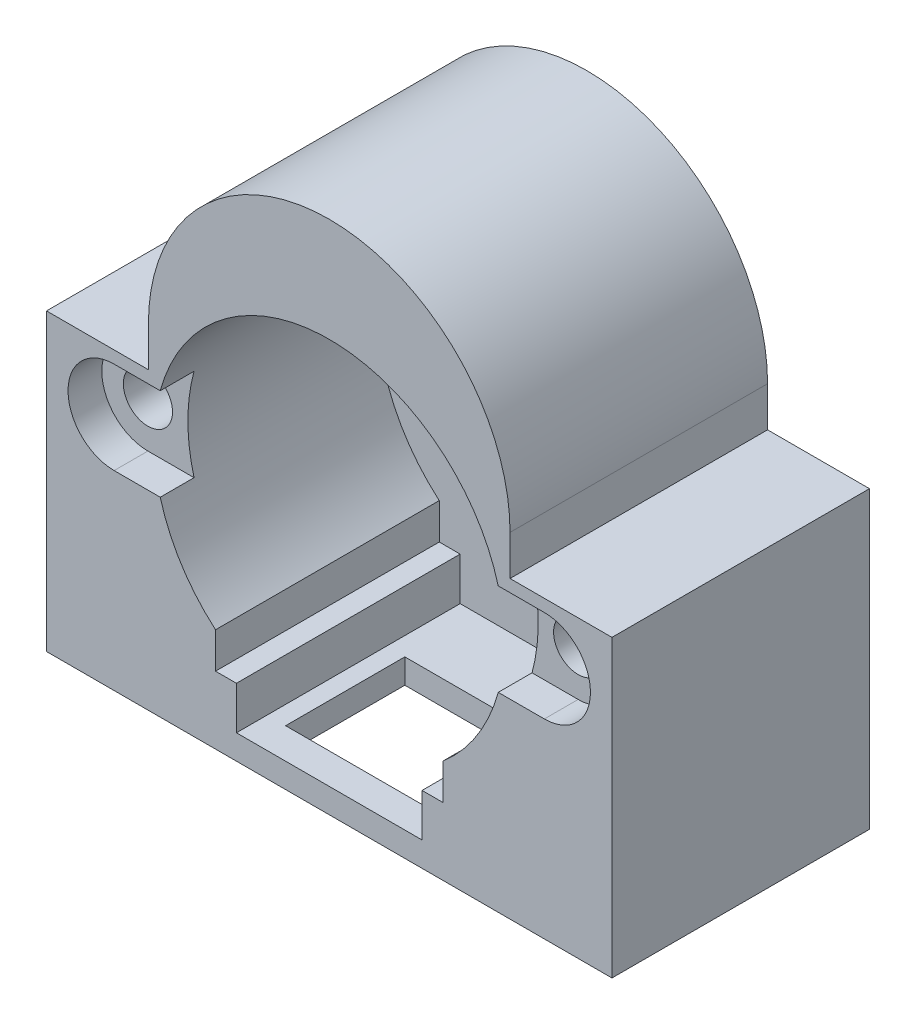
ISO-10303-21;
HEADER;
FILE_DESCRIPTION(('STEP AP214'),'2;1');
FILE_NAME('part.step','',(''),(''),'','','');
FILE_SCHEMA(('AUTOMOTIVE_DESIGN { 1 0 10303 214 1 1 1 1 }'));
ENDSEC;
DATA;
#1=APPLICATION_CONTEXT('core data for automotive mechanical design processes');
#2=APPLICATION_PROTOCOL_DEFINITION('international standard','automotive_design',2000,#1);
#3=PRODUCT_CONTEXT('',#1,'mechanical');
#4=PRODUCT('Part','Part','',(#3));
#5=PRODUCT_RELATED_PRODUCT_CATEGORY('part','',(#4));
#6=PRODUCT_DEFINITION_FORMATION('','',#4);
#7=PRODUCT_DEFINITION_CONTEXT('part definition',#1,'design');
#8=PRODUCT_DEFINITION('design','',#6,#7);
#9=PRODUCT_DEFINITION_SHAPE('','',#8);
#10=(LENGTH_UNIT() NAMED_UNIT(*) SI_UNIT(.MILLI.,.METRE.));
#11=(NAMED_UNIT(*) PLANE_ANGLE_UNIT() SI_UNIT($,.RADIAN.));
#12=(NAMED_UNIT(*) SI_UNIT($,.STERADIAN.) SOLID_ANGLE_UNIT());
#13=UNCERTAINTY_MEASURE_WITH_UNIT(LENGTH_MEASURE(1.E-05),#10,'distance_accuracy_value','');
#14=(GEOMETRIC_REPRESENTATION_CONTEXT(3) GLOBAL_UNCERTAINTY_ASSIGNED_CONTEXT((#13)) GLOBAL_UNIT_ASSIGNED_CONTEXT((#10,
#11,#12)) REPRESENTATION_CONTEXT('',''));
#15=CARTESIAN_POINT('',(0.,0.,0.));
#16=DIRECTION('',(0.,0.,1.));
#17=DIRECTION('',(1.,0.,0.));
#18=AXIS2_PLACEMENT_3D('',#15,#16,#17);
#19=CARTESIAN_POINT('',(-23.,-19.25,20.95));
#20=DIRECTION('',(0.,1.,0.));
#21=DIRECTION('',(0.,0.,1.));
#22=AXIS2_PLACEMENT_3D('',#19,#20,#21);
#23=PLANE('',#22);
#24=DIRECTION('',(0.,0.,-1.));
#25=VECTOR('',#24,1.);
#26=CARTESIAN_POINT('',(-23.,-19.25,20.95));
#27=LINE('',#26,#25);
#28=CARTESIAN_POINT('',(-23.,-19.25,20.95));
#29=VERTEX_POINT('',#28);
#30=CARTESIAN_POINT('',(-23.,-19.25,0.));
#31=VERTEX_POINT('',#30);
#32=EDGE_CURVE('E427',#29,#31,#27,.T.);
#33=ORIENTED_EDGE('',*,*,#32,.T.);
#34=DIRECTION('',(1.,0.,0.));
#35=VECTOR('',#34,1.);
#36=CARTESIAN_POINT('',(-23.,-19.25,0.));
#37=LINE('',#36,#35);
#38=CARTESIAN_POINT('',(23.,-19.25,0.));
#39=VERTEX_POINT('',#38);
#40=EDGE_CURVE('E419',#31,#39,#37,.T.);
#41=ORIENTED_EDGE('',*,*,#40,.T.);
#42=DIRECTION('',(0.,0.,-1.));
#43=VECTOR('',#42,1.);
#44=CARTESIAN_POINT('',(23.,-19.25,20.95));
#45=LINE('',#44,#43);
#46=CARTESIAN_POINT('',(23.,-19.25,20.95));
#47=VERTEX_POINT('',#46);
#48=EDGE_CURVE('E425',#47,#39,#45,.T.);
#49=ORIENTED_EDGE('',*,*,#48,.F.);
#50=DIRECTION('',(1.,0.,0.));
#51=VECTOR('',#50,1.);
#52=CARTESIAN_POINT('',(-23.,-19.25,20.95));
#53=LINE('',#52,#51);
#54=EDGE_CURVE('E408',#29,#47,#53,.T.);
#55=ORIENTED_EDGE('',*,*,#54,.F.);
#56=EDGE_LOOP('',(#33,#41,#49,#55));
#57=FACE_BOUND('',#56,.T.);
#58=DIRECTION('',(0.,0.,-1.));
#59=VECTOR('',#58,1.);
#60=CARTESIAN_POINT('',(6.05,-19.25,18.45));
#61=LINE('',#60,#59);
#62=CARTESIAN_POINT('',(6.05,-19.25,18.45));
#63=VERTEX_POINT('',#62);
#64=CARTESIAN_POINT('',(6.05,-19.25,8.75));
#65=VERTEX_POINT('',#64);
#66=EDGE_CURVE('E56',#63,#65,#61,.T.);
#67=ORIENTED_EDGE('',*,*,#66,.T.);
#68=DIRECTION('',(-1.,0.,0.));
#69=VECTOR('',#68,1.);
#70=CARTESIAN_POINT('',(6.05,-19.25,8.75));
#71=LINE('',#70,#69);
#72=CARTESIAN_POINT('',(-6.05,-19.25,8.75));
#73=VERTEX_POINT('',#72);
#74=EDGE_CURVE('E246',#65,#73,#71,.T.);
#75=ORIENTED_EDGE('',*,*,#74,.T.);
#76=DIRECTION('',(0.,0.,1.));
#77=VECTOR('',#76,1.);
#78=CARTESIAN_POINT('',(-6.05,-19.25,18.45));
#79=LINE('',#78,#77);
#80=CARTESIAN_POINT('',(-6.05,-19.25,18.45));
#81=VERTEX_POINT('',#80);
#82=EDGE_CURVE('E253',#73,#81,#79,.T.);
#83=ORIENTED_EDGE('',*,*,#82,.T.);
#84=DIRECTION('',(1.,0.,0.));
#85=VECTOR('',#84,1.);
#86=CARTESIAN_POINT('',(6.05,-19.25,18.45));
#87=LINE('',#86,#85);
#88=EDGE_CURVE('E233',#81,#63,#87,.T.);
#89=ORIENTED_EDGE('',*,*,#88,.T.);
#90=EDGE_LOOP('',(#67,#75,#83,#89));
#91=FACE_BOUND('',#90,.T.);
#92=ADVANCED_FACE('F39',(#57,#91),#23,.F.);
#93=CARTESIAN_POINT('',(-7.55,-17.25,20.95));
#94=DIRECTION('',(0.,1.,0.));
#95=DIRECTION('',(0.,0.,1.));
#96=AXIS2_PLACEMENT_3D('',#93,#94,#95);
#97=PLANE('',#96);
#98=DIRECTION('',(1.,0.,0.));
#99=VECTOR('',#98,1.);
#100=CARTESIAN_POINT('',(-7.55,-17.25,2.75));
#101=LINE('',#100,#99);
#102=CARTESIAN_POINT('',(-7.55,-17.25,2.75));
#103=VERTEX_POINT('',#102);
#104=CARTESIAN_POINT('',(7.55,-17.25,2.75));
#105=VERTEX_POINT('',#104);
#106=EDGE_CURVE('E354',#103,#105,#101,.T.);
#107=ORIENTED_EDGE('',*,*,#106,.F.);
#108=DIRECTION('',(0.,0.,-1.));
#109=VECTOR('',#108,1.);
#110=CARTESIAN_POINT('',(-7.55,-17.25,20.95));
#111=LINE('',#110,#109);
#112=CARTESIAN_POINT('',(-7.55,-17.25,20.95));
#113=VERTEX_POINT('',#112);
#114=EDGE_CURVE('E399',#113,#103,#111,.T.);
#115=ORIENTED_EDGE('',*,*,#114,.F.);
#116=DIRECTION('',(1.,0.,0.));
#117=VECTOR('',#116,1.);
#118=CARTESIAN_POINT('',(-7.55,-17.25,20.95));
#119=LINE('',#118,#117);
#120=CARTESIAN_POINT('',(7.55,-17.25,20.95));
#121=VERTEX_POINT('',#120);
#122=EDGE_CURVE('E367',#113,#121,#119,.T.);
#123=ORIENTED_EDGE('',*,*,#122,.T.);
#124=DIRECTION('',(0.,0.,-1.));
#125=VECTOR('',#124,1.);
#126=CARTESIAN_POINT('',(7.55,-17.25,20.95));
#127=LINE('',#126,#125);
#128=EDGE_CURVE('E396',#121,#105,#127,.T.);
#129=ORIENTED_EDGE('',*,*,#128,.T.);
#130=EDGE_LOOP('',(#107,#115,#123,#129));
#131=FACE_BOUND('',#130,.T.);
#132=DIRECTION('',(-1.,0.,0.));
#133=VECTOR('',#132,1.);
#134=CARTESIAN_POINT('',(6.05,-17.25,8.75));
#135=LINE('',#134,#133);
#136=CARTESIAN_POINT('',(6.05,-17.25,8.75));
#137=VERTEX_POINT('',#136);
#138=CARTESIAN_POINT('',(-6.05,-17.25,8.75));
#139=VERTEX_POINT('',#138);
#140=EDGE_CURVE('E244',#137,#139,#135,.T.);
#141=ORIENTED_EDGE('',*,*,#140,.F.);
#142=DIRECTION('',(0.,0.,-1.));
#143=VECTOR('',#142,1.);
#144=CARTESIAN_POINT('',(6.05,-17.25,18.45));
#145=LINE('',#144,#143);
#146=CARTESIAN_POINT('',(6.05,-17.25,18.45));
#147=VERTEX_POINT('',#146);
#148=EDGE_CURVE('E227',#147,#137,#145,.T.);
#149=ORIENTED_EDGE('',*,*,#148,.F.);
#150=DIRECTION('',(1.,0.,0.));
#151=VECTOR('',#150,1.);
#152=CARTESIAN_POINT('',(6.05,-17.25,18.45));
#153=LINE('',#152,#151);
#154=CARTESIAN_POINT('',(-6.05,-17.25,18.45));
#155=VERTEX_POINT('',#154);
#156=EDGE_CURVE('E236',#155,#147,#153,.T.);
#157=ORIENTED_EDGE('',*,*,#156,.F.);
#158=DIRECTION('',(0.,0.,1.));
#159=VECTOR('',#158,1.);
#160=CARTESIAN_POINT('',(-6.05,-17.25,18.45));
#161=LINE('',#160,#159);
#162=EDGE_CURVE('E64',#139,#155,#161,.T.);
#163=ORIENTED_EDGE('',*,*,#162,.F.);
#164=EDGE_LOOP('',(#141,#149,#157,#163));
#165=FACE_BOUND('',#164,.T.);
#166=ADVANCED_FACE('F242',(#131,#165),#97,.T.);
#167=CARTESIAN_POINT('',(0.,8.,20.95));
#168=DIRECTION('',(0.,0.,1.));
#169=DIRECTION('',(1.,0.,0.));
#170=AXIS2_PLACEMENT_3D('',#167,#168,#169);
#171=PLANE('',#170);
#172=DIRECTION('',(-1.,0.,0.));
#173=VECTOR('',#172,1.);
#174=CARTESIAN_POINT('',(-17.5,3.75,20.95));
#175=LINE('',#174,#173);
#176=CARTESIAN_POINT('',(-13.7477270848675,3.75,20.95));
#177=VERTEX_POINT('',#176);
#178=CARTESIAN_POINT('',(-17.5,3.75,20.95));
#179=VERTEX_POINT('',#178);
#180=EDGE_CURVE('E317',#177,#179,#175,.T.);
#181=ORIENTED_EDGE('',*,*,#180,.F.);
#182=CARTESIAN_POINT('',(0.,0.,20.95));
#183=DIRECTION('',(0.,0.,1.));
#184=DIRECTION('',(1.,0.,0.));
#185=AXIS2_PLACEMENT_3D('',#182,#183,#184);
#186=CIRCLE('',#185,14.25);
#187=CARTESIAN_POINT('',(13.7477270848675,3.75,20.95));
#188=VERTEX_POINT('',#187);
#189=EDGE_CURVE('E380',#188,#177,#186,.T.);
#190=ORIENTED_EDGE('',*,*,#189,.F.);
#191=CARTESIAN_POINT('',(17.5,3.75,20.95));
#192=VERTEX_POINT('',#191);
#193=EDGE_CURVE('E299',#192,#188,#175,.T.);
#194=ORIENTED_EDGE('',*,*,#193,.F.);
#195=CARTESIAN_POINT('',(17.5,0.,20.95));
#196=DIRECTION('',(0.,0.,1.));
#197=DIRECTION('',(1.,0.,0.));
#198=AXIS2_PLACEMENT_3D('',#195,#196,#197);
#199=CIRCLE('',#198,3.75);
#200=CARTESIAN_POINT('',(17.5,-3.75,20.95));
#201=VERTEX_POINT('',#200);
#202=EDGE_CURVE('E314',#201,#192,#199,.T.);
#203=ORIENTED_EDGE('',*,*,#202,.F.);
#204=DIRECTION('',(1.,0.,0.));
#205=VECTOR('',#204,1.);
#206=CARTESIAN_POINT('',(-17.5,-3.75,20.95));
#207=LINE('',#206,#205);
#208=CARTESIAN_POINT('',(13.7477270848675,-3.75,20.95));
#209=VERTEX_POINT('',#208);
#210=EDGE_CURVE('E311',#209,#201,#207,.T.);
#211=ORIENTED_EDGE('',*,*,#210,.F.);
#212=CARTESIAN_POINT('',(9.25,-10.8397416943394,20.95));
#213=VERTEX_POINT('',#212);
#214=EDGE_CURVE('E376',#213,#209,#186,.T.);
#215=ORIENTED_EDGE('',*,*,#214,.F.);
#216=DIRECTION('',(0.,1.,0.));
#217=VECTOR('',#216,1.);
#218=CARTESIAN_POINT('',(9.25,-13.758885964431,20.95));
#219=LINE('',#218,#217);
#220=CARTESIAN_POINT('',(9.25,-13.758885964431,20.95));
#221=VERTEX_POINT('',#220);
#222=EDGE_CURVE('E373',#221,#213,#219,.T.);
#223=ORIENTED_EDGE('',*,*,#222,.F.);
#224=DIRECTION('',(1.,0.,0.));
#225=VECTOR('',#224,1.);
#226=CARTESIAN_POINT('',(7.55,-13.758885964431,20.95));
#227=LINE('',#226,#225);
#228=CARTESIAN_POINT('',(7.55,-13.758885964431,20.95));
#229=VERTEX_POINT('',#228);
#230=EDGE_CURVE('E371',#229,#221,#227,.T.);
#231=ORIENTED_EDGE('',*,*,#230,.F.);
#232=DIRECTION('',(0.,1.,0.));
#233=VECTOR('',#232,1.);
#234=CARTESIAN_POINT('',(7.55,-17.25,20.95));
#235=LINE('',#234,#233);
#236=EDGE_CURVE('E369',#121,#229,#235,.T.);
#237=ORIENTED_EDGE('',*,*,#236,.F.);
#238=ORIENTED_EDGE('',*,*,#122,.F.);
#239=DIRECTION('',(0.,-1.,0.));
#240=VECTOR('',#239,1.);
#241=CARTESIAN_POINT('',(-7.55,-13.758885964431,20.95));
#242=LINE('',#241,#240);
#243=CARTESIAN_POINT('',(-7.55,-13.758885964431,20.95));
#244=VERTEX_POINT('',#243);
#245=EDGE_CURVE('E365',#244,#113,#242,.T.);
#246=ORIENTED_EDGE('',*,*,#245,.F.);
#247=DIRECTION('',(1.,0.,0.));
#248=VECTOR('',#247,1.);
#249=CARTESIAN_POINT('',(-7.55,-13.758885964431,20.95));
#250=LINE('',#249,#248);
#251=CARTESIAN_POINT('',(-9.25,-13.758885964431,20.95));
#252=VERTEX_POINT('',#251);
#253=EDGE_CURVE('E363',#252,#244,#250,.T.);
#254=ORIENTED_EDGE('',*,*,#253,.F.);
#255=DIRECTION('',(0.,-1.,0.));
#256=VECTOR('',#255,1.);
#257=CARTESIAN_POINT('',(-9.25,-13.758885964431,20.95));
#258=LINE('',#257,#256);
#259=CARTESIAN_POINT('',(-9.25,-10.8397416943394,20.95));
#260=VERTEX_POINT('',#259);
#261=EDGE_CURVE('E379',#260,#252,#258,.T.);
#262=ORIENTED_EDGE('',*,*,#261,.F.);
#263=CARTESIAN_POINT('',(-13.7477270848675,-3.75,20.95));
#264=VERTEX_POINT('',#263);
#265=EDGE_CURVE('E375',#264,#260,#186,.T.);
#266=ORIENTED_EDGE('',*,*,#265,.F.);
#267=CARTESIAN_POINT('',(-17.5,-3.75,20.95));
#268=VERTEX_POINT('',#267);
#269=EDGE_CURVE('E312',#268,#264,#207,.T.);
#270=ORIENTED_EDGE('',*,*,#269,.F.);
#271=CARTESIAN_POINT('',(-17.5,0.,20.95));
#272=DIRECTION('',(0.,0.,1.));
#273=DIRECTION('',(1.,0.,0.));
#274=AXIS2_PLACEMENT_3D('',#271,#272,#273);
#275=CIRCLE('',#274,3.75);
#276=EDGE_CURVE('E292',#179,#268,#275,.T.);
#277=ORIENTED_EDGE('',*,*,#276,.F.);
#278=EDGE_LOOP('',(#181,#190,#194,#203,#211,#215,#223,#231,#237,#238,#246,#254,#262,#266,#270,#277));
#279=FACE_BOUND('',#278,.T.);
#280=CARTESIAN_POINT('',(0.,8.,20.95));
#281=DIRECTION('',(0.,0.,1.));
#282=DIRECTION('',(1.,0.,0.));
#283=AXIS2_PLACEMENT_3D('',#280,#281,#282);
#284=CIRCLE('',#283,14.7094857671614);
#285=CARTESIAN_POINT('',(14.7094857671614,8.,20.950012));
#286=VERTEX_POINT('',#285);
#287=CARTESIAN_POINT('',(-14.7094857671614,8.,20.950012));
#288=VERTEX_POINT('',#287);
#289=EDGE_CURVE('E409',#286,#288,#284,.T.);
#290=ORIENTED_EDGE('',*,*,#289,.T.);
#291=DIRECTION('',(0.,-1.,0.));
#292=VECTOR('',#291,1.);
#293=CARTESIAN_POINT('',(-14.7094857671614,8.,20.95));
#294=LINE('',#293,#292);
#295=CARTESIAN_POINT('',(-14.7094857671614,4.75,20.95));
#296=VERTEX_POINT('',#295);
#297=EDGE_CURVE('E289',#288,#296,#294,.T.);
#298=ORIENTED_EDGE('',*,*,#297,.T.);
#299=DIRECTION('',(-1.,0.,0.));
#300=VECTOR('',#299,1.);
#301=CARTESIAN_POINT('',(0.,4.75,20.95));
#302=LINE('',#301,#300);
#303=CARTESIAN_POINT('',(-23.,4.75,20.95));
#304=VERTEX_POINT('',#303);
#305=EDGE_CURVE('E286',#296,#304,#302,.T.);
#306=ORIENTED_EDGE('',*,*,#305,.T.);
#307=DIRECTION('',(0.,-1.,0.));
#308=VECTOR('',#307,1.);
#309=CARTESIAN_POINT('',(-23.,8.,20.95));
#310=LINE('',#309,#308);
#311=EDGE_CURVE('E406',#304,#29,#310,.T.);
#312=ORIENTED_EDGE('',*,*,#311,.T.);
#313=ORIENTED_EDGE('',*,*,#54,.T.);
#314=DIRECTION('',(0.,1.,0.));
#315=VECTOR('',#314,1.);
#316=CARTESIAN_POINT('',(23.,8.,20.95));
#317=LINE('',#316,#315);
#318=CARTESIAN_POINT('',(23.,4.75,20.95));
#319=VERTEX_POINT('',#318);
#320=EDGE_CURVE('E411',#47,#319,#317,.T.);
#321=ORIENTED_EDGE('',*,*,#320,.T.);
#322=DIRECTION('',(-1.,0.,0.));
#323=VECTOR('',#322,1.);
#324=CARTESIAN_POINT('',(0.,4.75,20.95));
#325=LINE('',#324,#323);
#326=CARTESIAN_POINT('',(14.7094857671614,4.75,20.95));
#327=VERTEX_POINT('',#326);
#328=EDGE_CURVE('E281',#319,#327,#325,.T.);
#329=ORIENTED_EDGE('',*,*,#328,.T.);
#330=DIRECTION('',(0.,1.,0.));
#331=VECTOR('',#330,1.);
#332=CARTESIAN_POINT('',(14.7094857671614,8.,20.95));
#333=LINE('',#332,#331);
#334=EDGE_CURVE('E270',#327,#286,#333,.T.);
#335=ORIENTED_EDGE('',*,*,#334,.T.);
#336=EDGE_LOOP('',(#290,#298,#306,#312,#313,#321,#329,#335));
#337=FACE_BOUND('',#336,.T.);
#338=ADVANCED_FACE('F467',(#279,#337),#171,.T.);
#339=CARTESIAN_POINT('',(0.,8.,0.));
#340=DIRECTION('',(0.,0.,1.));
#341=DIRECTION('',(1.,0.,0.));
#342=AXIS2_PLACEMENT_3D('',#339,#340,#341);
#343=PLANE('',#342);
#344=DIRECTION('',(0.,1.,0.));
#345=VECTOR('',#344,1.);
#346=CARTESIAN_POINT('',(-14.7094857671614,8.,0.));
#347=LINE('',#346,#345);
#348=CARTESIAN_POINT('',(-14.7094857671614,4.75,0.));
#349=VERTEX_POINT('',#348);
#350=CARTESIAN_POINT('',(-14.7094857671614,8.,0.));
#351=VERTEX_POINT('',#350);
#352=EDGE_CURVE('E261',#349,#351,#347,.T.);
#353=ORIENTED_EDGE('',*,*,#352,.T.);
#354=CARTESIAN_POINT('',(0.,8.,0.));
#355=DIRECTION('',(0.,0.,1.));
#356=DIRECTION('',(1.,0.,0.));
#357=AXIS2_PLACEMENT_3D('',#354,#355,#356);
#358=CIRCLE('',#357,14.7094857671614);
#359=CARTESIAN_POINT('',(14.7094857671614,8.,0.));
#360=VERTEX_POINT('',#359);
#361=EDGE_CURVE('E405',#360,#351,#358,.T.);
#362=ORIENTED_EDGE('',*,*,#361,.F.);
#363=DIRECTION('',(0.,-1.,0.));
#364=VECTOR('',#363,1.);
#365=CARTESIAN_POINT('',(14.7094857671614,8.,0.));
#366=LINE('',#365,#364);
#367=CARTESIAN_POINT('',(14.7094857671614,4.75,0.));
#368=VERTEX_POINT('',#367);
#369=EDGE_CURVE('E265',#360,#368,#366,.T.);
#370=ORIENTED_EDGE('',*,*,#369,.T.);
#371=DIRECTION('',(1.,0.,0.));
#372=VECTOR('',#371,1.);
#373=CARTESIAN_POINT('',(14.7094857671614,4.75,0.));
#374=LINE('',#373,#372);
#375=CARTESIAN_POINT('',(23.,4.75,0.));
#376=VERTEX_POINT('',#375);
#377=EDGE_CURVE('E274',#368,#376,#374,.T.);
#378=ORIENTED_EDGE('',*,*,#377,.T.);
#379=DIRECTION('',(0.,1.,0.));
#380=VECTOR('',#379,1.);
#381=CARTESIAN_POINT('',(23.,8.,0.));
#382=LINE('',#381,#380);
#383=EDGE_CURVE('E422',#39,#376,#382,.T.);
#384=ORIENTED_EDGE('',*,*,#383,.F.);
#385=ORIENTED_EDGE('',*,*,#40,.F.);
#386=DIRECTION('',(0.,-1.,0.));
#387=VECTOR('',#386,1.);
#388=CARTESIAN_POINT('',(-23.,8.,0.));
#389=LINE('',#388,#387);
#390=CARTESIAN_POINT('',(-23.,4.75,0.));
#391=VERTEX_POINT('',#390);
#392=EDGE_CURVE('E417',#391,#31,#389,.T.);
#393=ORIENTED_EDGE('',*,*,#392,.F.);
#394=DIRECTION('',(1.,0.,0.));
#395=VECTOR('',#394,1.);
#396=CARTESIAN_POINT('',(-14.7094857671614,4.75,0.));
#397=LINE('',#396,#395);
#398=EDGE_CURVE('E264',#391,#349,#397,.T.);
#399=ORIENTED_EDGE('',*,*,#398,.T.);
#400=EDGE_LOOP('',(#353,#362,#370,#378,#384,#385,#393,#399));
#401=FACE_BOUND('',#400,.T.);
#402=ADVANCED_FACE('F461',(#401),#343,.F.);
#403=CARTESIAN_POINT('',(-23.,8.,20.95));
#404=DIRECTION('',(1.,0.,0.));
#405=DIRECTION('',(0.,0.,-1.));
#406=AXIS2_PLACEMENT_3D('',#403,#404,#405);
#407=PLANE('',#406);
#408=DIRECTION('',(0.,0.,1.));
#409=VECTOR('',#408,1.);
#410=CARTESIAN_POINT('',(-23.,4.75,20.95));
#411=LINE('',#410,#409);
#412=EDGE_CURVE('E11',#391,#304,#411,.T.);
#413=ORIENTED_EDGE('',*,*,#412,.F.);
#414=ORIENTED_EDGE('',*,*,#392,.T.);
#415=ORIENTED_EDGE('',*,*,#32,.F.);
#416=ORIENTED_EDGE('',*,*,#311,.F.);
#417=EDGE_LOOP('',(#413,#414,#415,#416));
#418=FACE_BOUND('',#417,.T.);
#419=ADVANCED_FACE('F485',(#418),#407,.F.);
#420=CARTESIAN_POINT('',(23.,8.,20.95));
#421=DIRECTION('',(-1.,0.,0.));
#422=DIRECTION('',(0.,0.,1.));
#423=AXIS2_PLACEMENT_3D('',#420,#421,#422);
#424=PLANE('',#423);
#425=DIRECTION('',(0.,0.,-1.));
#426=VECTOR('',#425,1.);
#427=CARTESIAN_POINT('',(23.,4.75,20.950012));
#428=LINE('',#427,#426);
#429=EDGE_CURVE('E272',#319,#376,#428,.T.);
#430=ORIENTED_EDGE('',*,*,#429,.F.);
#431=ORIENTED_EDGE('',*,*,#320,.F.);
#432=ORIENTED_EDGE('',*,*,#48,.T.);
#433=ORIENTED_EDGE('',*,*,#383,.T.);
#434=EDGE_LOOP('',(#430,#431,#432,#433));
#435=FACE_BOUND('',#434,.T.);
#436=ADVANCED_FACE('F474',(#435),#424,.F.);
#437=CARTESIAN_POINT('',(0.,8.,20.95));
#438=DIRECTION('',(0.,0.,-1.));
#439=DIRECTION('',(-1.,0.,0.));
#440=AXIS2_PLACEMENT_3D('',#437,#438,#439);
#441=CYLINDRICAL_SURFACE('',#440,14.7094857671614);
#442=DIRECTION('',(0.,0.,-1.));
#443=VECTOR('',#442,1.);
#444=CARTESIAN_POINT('',(14.7094857671614,8.,20.95));
#445=LINE('',#444,#443);
#446=EDGE_CURVE('E414',#286,#360,#445,.T.);
#447=ORIENTED_EDGE('',*,*,#446,.T.);
#448=ORIENTED_EDGE('',*,*,#361,.T.);
#449=DIRECTION('',(0.,0.,-1.));
#450=VECTOR('',#449,1.);
#451=CARTESIAN_POINT('',(-14.7094857671614,8.,20.95));
#452=LINE('',#451,#450);
#453=EDGE_CURVE('E430',#288,#351,#452,.T.);
#454=ORIENTED_EDGE('',*,*,#453,.F.);
#455=ORIENTED_EDGE('',*,*,#289,.F.);
#456=EDGE_LOOP('',(#447,#448,#454,#455));
#457=FACE_BOUND('',#456,.T.);
#458=ADVANCED_FACE('F41',(#457),#441,.T.);
#459=CARTESIAN_POINT('',(-7.55,-13.758885964431,20.95));
#460=DIRECTION('',(0.,1.,0.));
#461=DIRECTION('',(0.,0.,1.));
#462=AXIS2_PLACEMENT_3D('',#459,#460,#461);
#463=PLANE('',#462);
#464=DIRECTION('',(1.,0.,0.));
#465=VECTOR('',#464,1.);
#466=CARTESIAN_POINT('',(-7.55,-13.758885964431,2.75));
#467=LINE('',#466,#465);
#468=CARTESIAN_POINT('',(-9.25,-13.758885964431,2.75));
#469=VERTEX_POINT('',#468);
#470=CARTESIAN_POINT('',(-7.55,-13.758885964431,2.75));
#471=VERTEX_POINT('',#470);
#472=EDGE_CURVE('E360',#469,#471,#467,.T.);
#473=ORIENTED_EDGE('',*,*,#472,.F.);
#474=DIRECTION('',(0.,0.,-1.));
#475=VECTOR('',#474,1.);
#476=CARTESIAN_POINT('',(-9.25,-13.758885964431,20.95));
#477=LINE('',#476,#475);
#478=EDGE_CURVE('E382',#252,#469,#477,.T.);
#479=ORIENTED_EDGE('',*,*,#478,.F.);
#480=ORIENTED_EDGE('',*,*,#253,.T.);
#481=DIRECTION('',(0.,0.,-1.));
#482=VECTOR('',#481,1.);
#483=CARTESIAN_POINT('',(-7.55,-13.758885964431,20.95));
#484=LINE('',#483,#482);
#485=EDGE_CURVE('E402',#244,#471,#484,.T.);
#486=ORIENTED_EDGE('',*,*,#485,.T.);
#487=EDGE_LOOP('',(#473,#479,#480,#486));
#488=FACE_BOUND('',#487,.T.);
#489=ADVANCED_FACE('F517',(#488),#463,.T.);
#490=CARTESIAN_POINT('',(-7.55,-13.758885964431,20.95));
#491=DIRECTION('',(1.,0.,0.));
#492=DIRECTION('',(0.,0.,-1.));
#493=AXIS2_PLACEMENT_3D('',#490,#491,#492);
#494=PLANE('',#493);
#495=DIRECTION('',(0.,-1.,0.));
#496=VECTOR('',#495,1.);
#497=CARTESIAN_POINT('',(-7.55,-13.758885964431,2.75));
#498=LINE('',#497,#496);
#499=EDGE_CURVE('E357',#471,#103,#498,.T.);
#500=ORIENTED_EDGE('',*,*,#499,.F.);
#501=ORIENTED_EDGE('',*,*,#485,.F.);
#502=ORIENTED_EDGE('',*,*,#245,.T.);
#503=ORIENTED_EDGE('',*,*,#114,.T.);
#504=EDGE_LOOP('',(#500,#501,#502,#503));
#505=FACE_BOUND('',#504,.T.);
#506=ADVANCED_FACE('F520',(#505),#494,.T.);
#507=CARTESIAN_POINT('',(7.55,-17.25,20.95));
#508=DIRECTION('',(-1.,0.,0.));
#509=DIRECTION('',(0.,-1.,0.));
#510=AXIS2_PLACEMENT_3D('',#507,#508,#509);
#511=PLANE('',#510);
#512=DIRECTION('',(0.,1.,0.));
#513=VECTOR('',#512,1.);
#514=CARTESIAN_POINT('',(7.55,-17.25,2.75));
#515=LINE('',#514,#513);
#516=CARTESIAN_POINT('',(7.55,-13.758885964431,2.75));
#517=VERTEX_POINT('',#516);
#518=EDGE_CURVE('E351',#105,#517,#515,.T.);
#519=ORIENTED_EDGE('',*,*,#518,.F.);
#520=ORIENTED_EDGE('',*,*,#128,.F.);
#521=ORIENTED_EDGE('',*,*,#236,.T.);
#522=DIRECTION('',(0.,0.,-1.));
#523=VECTOR('',#522,1.);
#524=CARTESIAN_POINT('',(7.55,-13.758885964431,20.95));
#525=LINE('',#524,#523);
#526=EDGE_CURVE('E393',#229,#517,#525,.T.);
#527=ORIENTED_EDGE('',*,*,#526,.T.);
#528=EDGE_LOOP('',(#519,#520,#521,#527));
#529=FACE_BOUND('',#528,.T.);
#530=ADVANCED_FACE('F523',(#529),#511,.T.);
#531=CARTESIAN_POINT('',(7.55,-13.758885964431,20.95));
#532=DIRECTION('',(0.,1.,0.));
#533=DIRECTION('',(0.,0.,1.));
#534=AXIS2_PLACEMENT_3D('',#531,#532,#533);
#535=PLANE('',#534);
#536=DIRECTION('',(1.,0.,0.));
#537=VECTOR('',#536,1.);
#538=CARTESIAN_POINT('',(7.55,-13.758885964431,2.75));
#539=LINE('',#538,#537);
#540=CARTESIAN_POINT('',(9.25,-13.758885964431,2.75));
#541=VERTEX_POINT('',#540);
#542=EDGE_CURVE('E348',#517,#541,#539,.T.);
#543=ORIENTED_EDGE('',*,*,#542,.F.);
#544=ORIENTED_EDGE('',*,*,#526,.F.);
#545=ORIENTED_EDGE('',*,*,#230,.T.);
#546=DIRECTION('',(0.,0.,-1.));
#547=VECTOR('',#546,1.);
#548=CARTESIAN_POINT('',(9.25,-13.758885964431,20.95));
#549=LINE('',#548,#547);
#550=EDGE_CURVE('E390',#221,#541,#549,.T.);
#551=ORIENTED_EDGE('',*,*,#550,.T.);
#552=EDGE_LOOP('',(#543,#544,#545,#551));
#553=FACE_BOUND('',#552,.T.);
#554=ADVANCED_FACE('F528',(#553),#535,.T.);
#555=CARTESIAN_POINT('',(9.25,-13.758885964431,20.95));
#556=DIRECTION('',(-1.,0.,0.));
#557=DIRECTION('',(0.,0.,1.));
#558=AXIS2_PLACEMENT_3D('',#555,#556,#557);
#559=PLANE('',#558);
#560=DIRECTION('',(0.,1.,0.));
#561=VECTOR('',#560,1.);
#562=CARTESIAN_POINT('',(9.25,-13.758885964431,2.75));
#563=LINE('',#562,#561);
#564=CARTESIAN_POINT('',(9.25,-10.8397416943394,2.75));
#565=VERTEX_POINT('',#564);
#566=EDGE_CURVE('E345',#541,#565,#563,.T.);
#567=ORIENTED_EDGE('',*,*,#566,.F.);
#568=ORIENTED_EDGE('',*,*,#550,.F.);
#569=ORIENTED_EDGE('',*,*,#222,.T.);
#570=DIRECTION('',(0.,0.,-1.));
#571=VECTOR('',#570,1.);
#572=CARTESIAN_POINT('',(9.25,-10.8397416943394,20.95));
#573=LINE('',#572,#571);
#574=EDGE_CURVE('E387',#213,#565,#573,.T.);
#575=ORIENTED_EDGE('',*,*,#574,.T.);
#576=EDGE_LOOP('',(#567,#568,#569,#575));
#577=FACE_BOUND('',#576,.T.);
#578=ADVANCED_FACE('F532',(#577),#559,.T.);
#579=CARTESIAN_POINT('',(0.,0.,20.95));
#580=DIRECTION('',(0.,0.,-1.));
#581=DIRECTION('',(-1.,0.,0.));
#582=AXIS2_PLACEMENT_3D('',#579,#580,#581);
#583=CYLINDRICAL_SURFACE('',#582,14.25);
#584=DIRECTION('',(0.,0.,-1.));
#585=VECTOR('',#584,1.);
#586=CARTESIAN_POINT('',(-13.7477270848675,3.75,20.95));
#587=LINE('',#586,#585);
#588=CARTESIAN_POINT('',(-13.7477270848675,3.75,18.2));
#589=VERTEX_POINT('',#588);
#590=EDGE_CURVE('E48',#589,#177,#587,.F.);
#591=ORIENTED_EDGE('',*,*,#590,.F.);
#592=CARTESIAN_POINT('',(0.,0.,18.2));
#593=DIRECTION('',(0.,0.,1.));
#594=DIRECTION('',(1.,0.,0.));
#595=AXIS2_PLACEMENT_3D('',#592,#593,#594);
#596=CIRCLE('',#595,14.25);
#597=CARTESIAN_POINT('',(-13.7477270848675,-3.75,18.2));
#598=VERTEX_POINT('',#597);
#599=EDGE_CURVE('E335',#589,#598,#596,.T.);
#600=ORIENTED_EDGE('',*,*,#599,.T.);
#601=DIRECTION('',(0.,0.,-1.));
#602=VECTOR('',#601,1.);
#603=CARTESIAN_POINT('',(-13.7477270848675,-3.75,20.95));
#604=LINE('',#603,#602);
#605=EDGE_CURVE('E441',#264,#598,#604,.T.);
#606=ORIENTED_EDGE('',*,*,#605,.F.);
#607=ORIENTED_EDGE('',*,*,#265,.T.);
#608=DIRECTION('',(0.,0.,-1.));
#609=VECTOR('',#608,1.);
#610=CARTESIAN_POINT('',(-9.25,-10.8397416943394,20.95));
#611=LINE('',#610,#609);
#612=CARTESIAN_POINT('',(-9.25,-10.8397416943394,2.75));
#613=VERTEX_POINT('',#612);
#614=EDGE_CURVE('E384',#260,#613,#611,.T.);
#615=ORIENTED_EDGE('',*,*,#614,.T.);
#616=CARTESIAN_POINT('',(0.,0.,2.75));
#617=DIRECTION('',(0.,0.,1.));
#618=DIRECTION('',(1.,0.,0.));
#619=AXIS2_PLACEMENT_3D('',#616,#617,#618);
#620=CIRCLE('',#619,14.25);
#621=EDGE_CURVE('E339',#565,#613,#620,.T.);
#622=ORIENTED_EDGE('',*,*,#621,.F.);
#623=ORIENTED_EDGE('',*,*,#574,.F.);
#624=ORIENTED_EDGE('',*,*,#214,.T.);
#625=DIRECTION('',(0.,0.,-1.));
#626=VECTOR('',#625,1.);
#627=CARTESIAN_POINT('',(13.7477270848675,-3.75,20.95));
#628=LINE('',#627,#626);
#629=CARTESIAN_POINT('',(13.7477270848675,-3.75,18.2));
#630=VERTEX_POINT('',#629);
#631=EDGE_CURVE('E434',#630,#209,#628,.F.);
#632=ORIENTED_EDGE('',*,*,#631,.F.);
#633=CARTESIAN_POINT('',(13.7477270848675,3.75,18.2));
#634=VERTEX_POINT('',#633);
#635=EDGE_CURVE('E332',#630,#634,#596,.T.);
#636=ORIENTED_EDGE('',*,*,#635,.T.);
#637=DIRECTION('',(0.,0.,-1.));
#638=VECTOR('',#637,1.);
#639=CARTESIAN_POINT('',(13.7477270848675,3.75,20.95));
#640=LINE('',#639,#638);
#641=EDGE_CURVE('E438',#188,#634,#640,.T.);
#642=ORIENTED_EDGE('',*,*,#641,.F.);
#643=ORIENTED_EDGE('',*,*,#189,.T.);
#644=EDGE_LOOP('',(#591,#600,#606,#607,#615,#622,#623,#624,#632,#636,#642,#643));
#645=FACE_BOUND('',#644,.T.);
#646=ADVANCED_FACE('F536',(#645),#583,.F.);
#647=CARTESIAN_POINT('',(-9.25,-13.758885964431,20.95));
#648=DIRECTION('',(1.,0.,0.));
#649=DIRECTION('',(0.,0.,-1.));
#650=AXIS2_PLACEMENT_3D('',#647,#648,#649);
#651=PLANE('',#650);
#652=DIRECTION('',(0.,-1.,0.));
#653=VECTOR('',#652,1.);
#654=CARTESIAN_POINT('',(-9.25,-13.758885964431,2.75));
#655=LINE('',#654,#653);
#656=EDGE_CURVE('E431',#613,#469,#655,.T.);
#657=ORIENTED_EDGE('',*,*,#656,.F.);
#658=ORIENTED_EDGE('',*,*,#614,.F.);
#659=ORIENTED_EDGE('',*,*,#261,.T.);
#660=ORIENTED_EDGE('',*,*,#478,.T.);
#661=EDGE_LOOP('',(#657,#658,#659,#660));
#662=FACE_BOUND('',#661,.T.);
#663=ADVANCED_FACE('F540',(#662),#651,.T.);
#664=CARTESIAN_POINT('',(0.,8.,2.75));
#665=DIRECTION('',(0.,0.,1.));
#666=DIRECTION('',(1.,0.,0.));
#667=AXIS2_PLACEMENT_3D('',#664,#665,#666);
#668=PLANE('',#667);
#669=ORIENTED_EDGE('',*,*,#656,.T.);
#670=ORIENTED_EDGE('',*,*,#472,.T.);
#671=ORIENTED_EDGE('',*,*,#499,.T.);
#672=ORIENTED_EDGE('',*,*,#106,.T.);
#673=ORIENTED_EDGE('',*,*,#518,.T.);
#674=ORIENTED_EDGE('',*,*,#542,.T.);
#675=ORIENTED_EDGE('',*,*,#566,.T.);
#676=ORIENTED_EDGE('',*,*,#621,.T.);
#677=EDGE_LOOP('',(#669,#670,#671,#672,#673,#674,#675,#676));
#678=FACE_BOUND('',#677,.T.);
#679=ADVANCED_FACE('F544',(#678),#668,.T.);
#680=CARTESIAN_POINT('',(-17.5,0.,18.2));
#681=DIRECTION('',(0.,0.,1.));
#682=DIRECTION('',(1.,0.,0.));
#683=AXIS2_PLACEMENT_3D('',#680,#681,#682);
#684=PLANE('',#683);
#685=CARTESIAN_POINT('',(-17.5,0.,18.2));
#686=DIRECTION('',(0.,0.,1.));
#687=DIRECTION('',(1.,0.,0.));
#688=AXIS2_PLACEMENT_3D('',#685,#686,#687);
#689=CIRCLE('',#688,2.);
#690=CARTESIAN_POINT('',(-15.5,0.,18.2));
#691=VERTEX_POINT('',#690);
#692=EDGE_CURVE('E322',#691,#691,#689,.F.);
#693=ORIENTED_EDGE('',*,*,#692,.T.);
#694=EDGE_LOOP('',(#693));
#695=FACE_BOUND('',#694,.T.);
#696=DIRECTION('',(-1.,0.,0.));
#697=VECTOR('',#696,1.);
#698=CARTESIAN_POINT('',(-17.5,3.75,18.2));
#699=LINE('',#698,#697);
#700=CARTESIAN_POINT('',(-17.5,3.75,18.2));
#701=VERTEX_POINT('',#700);
#702=EDGE_CURVE('E305',#589,#701,#699,.T.);
#703=ORIENTED_EDGE('',*,*,#702,.T.);
#704=CARTESIAN_POINT('',(-17.5,0.,18.2));
#705=DIRECTION('',(0.,0.,1.));
#706=DIRECTION('',(1.,0.,0.));
#707=AXIS2_PLACEMENT_3D('',#704,#705,#706);
#708=CIRCLE('',#707,3.75);
#709=CARTESIAN_POINT('',(-17.5,-3.75,18.2));
#710=VERTEX_POINT('',#709);
#711=EDGE_CURVE('E295',#701,#710,#708,.T.);
#712=ORIENTED_EDGE('',*,*,#711,.T.);
#713=DIRECTION('',(1.,0.,0.));
#714=VECTOR('',#713,1.);
#715=CARTESIAN_POINT('',(-17.5,-3.75,18.2));
#716=LINE('',#715,#714);
#717=EDGE_CURVE('E300',#710,#598,#716,.T.);
#718=ORIENTED_EDGE('',*,*,#717,.T.);
#719=ORIENTED_EDGE('',*,*,#599,.F.);
#720=EDGE_LOOP('',(#703,#712,#718,#719));
#721=FACE_BOUND('',#720,.T.);
#722=ADVANCED_FACE('F548',(#695,#721),#684,.T.);
#723=CARTESIAN_POINT('',(-17.5,-3.75,18.2));
#724=DIRECTION('',(0.,-1.,0.));
#725=DIRECTION('',(0.,0.,-1.));
#726=AXIS2_PLACEMENT_3D('',#723,#724,#725);
#727=PLANE('',#726);
#728=ORIENTED_EDGE('',*,*,#605,.T.);
#729=ORIENTED_EDGE('',*,*,#717,.F.);
#730=DIRECTION('',(0.,0.,1.));
#731=VECTOR('',#730,1.);
#732=CARTESIAN_POINT('',(-17.5,-3.75,18.2));
#733=LINE('',#732,#731);
#734=EDGE_CURVE('E308',#710,#268,#733,.T.);
#735=ORIENTED_EDGE('',*,*,#734,.T.);
#736=ORIENTED_EDGE('',*,*,#269,.T.);
#737=EDGE_LOOP('',(#728,#729,#735,#736));
#738=FACE_BOUND('',#737,.T.);
#739=ADVANCED_FACE('F577',(#738),#727,.F.);
#740=CARTESIAN_POINT('',(-17.5,3.75,18.2));
#741=DIRECTION('',(0.,1.,0.));
#742=DIRECTION('',(0.,0.,1.));
#743=AXIS2_PLACEMENT_3D('',#740,#741,#742);
#744=PLANE('',#743);
#745=ORIENTED_EDGE('',*,*,#590,.T.);
#746=ORIENTED_EDGE('',*,*,#180,.T.);
#747=DIRECTION('',(0.,0.,1.));
#748=VECTOR('',#747,1.);
#749=CARTESIAN_POINT('',(-17.5,3.75,18.2));
#750=LINE('',#749,#748);
#751=EDGE_CURVE('E319',#701,#179,#750,.T.);
#752=ORIENTED_EDGE('',*,*,#751,.F.);
#753=ORIENTED_EDGE('',*,*,#702,.F.);
#754=EDGE_LOOP('',(#745,#746,#752,#753));
#755=FACE_BOUND('',#754,.T.);
#756=ADVANCED_FACE('F571',(#755),#744,.F.);
#757=CARTESIAN_POINT('',(-17.5,0.,18.2));
#758=DIRECTION('',(0.,0.,1.));
#759=DIRECTION('',(1.,0.,0.));
#760=AXIS2_PLACEMENT_3D('',#757,#758,#759);
#761=CYLINDRICAL_SURFACE('',#760,3.75);
#762=ORIENTED_EDGE('',*,*,#276,.T.);
#763=ORIENTED_EDGE('',*,*,#734,.F.);
#764=ORIENTED_EDGE('',*,*,#711,.F.);
#765=ORIENTED_EDGE('',*,*,#751,.T.);
#766=EDGE_LOOP('',(#762,#763,#764,#765));
#767=FACE_BOUND('',#766,.T.);
#768=ADVANCED_FACE('F567',(#767),#761,.F.);
#769=ORIENTED_EDGE('',*,*,#641,.T.);
#770=CARTESIAN_POINT('',(17.5,3.75,18.2));
#771=VERTEX_POINT('',#770);
#772=EDGE_CURVE('E306',#771,#634,#699,.T.);
#773=ORIENTED_EDGE('',*,*,#772,.F.);
#774=DIRECTION('',(0.,0.,1.));
#775=VECTOR('',#774,1.);
#776=CARTESIAN_POINT('',(17.5,3.75,18.2));
#777=LINE('',#776,#775);
#778=EDGE_CURVE('E323',#771,#192,#777,.T.);
#779=ORIENTED_EDGE('',*,*,#778,.T.);
#780=ORIENTED_EDGE('',*,*,#193,.T.);
#781=EDGE_LOOP('',(#769,#773,#779,#780));
#782=FACE_BOUND('',#781,.T.);
#783=ADVANCED_FACE('F570',(#782),#744,.F.);
#784=CARTESIAN_POINT('',(17.5,-3.75,18.2));
#785=VERTEX_POINT('',#784);
#786=EDGE_CURVE('E298',#630,#785,#716,.T.);
#787=ORIENTED_EDGE('',*,*,#786,.T.);
#788=CARTESIAN_POINT('',(17.5,0.,18.2));
#789=DIRECTION('',(0.,0.,1.));
#790=DIRECTION('',(1.,0.,0.));
#791=AXIS2_PLACEMENT_3D('',#788,#789,#790);
#792=CIRCLE('',#791,3.75);
#793=EDGE_CURVE('E302',#785,#771,#792,.T.);
#794=ORIENTED_EDGE('',*,*,#793,.T.);
#795=ORIENTED_EDGE('',*,*,#772,.T.);
#796=ORIENTED_EDGE('',*,*,#635,.F.);
#797=EDGE_LOOP('',(#787,#794,#795,#796));
#798=FACE_BOUND('',#797,.T.);
#799=CARTESIAN_POINT('',(17.5,0.,18.2));
#800=DIRECTION('',(0.,0.,1.));
#801=DIRECTION('',(1.,0.,0.));
#802=AXIS2_PLACEMENT_3D('',#799,#800,#801);
#803=CIRCLE('',#802,2.);
#804=CARTESIAN_POINT('',(19.5,0.,18.2));
#805=VERTEX_POINT('',#804);
#806=EDGE_CURVE('E329',#805,#805,#803,.F.);
#807=ORIENTED_EDGE('',*,*,#806,.T.);
#808=EDGE_LOOP('',(#807));
#809=FACE_BOUND('',#808,.T.);
#810=ADVANCED_FACE('F580',(#798,#809),#684,.T.);
#811=CARTESIAN_POINT('',(17.5,0.,18.2));
#812=DIRECTION('',(0.,0.,1.));
#813=DIRECTION('',(1.,0.,0.));
#814=AXIS2_PLACEMENT_3D('',#811,#812,#813);
#815=CYLINDRICAL_SURFACE('',#814,3.75);
#816=ORIENTED_EDGE('',*,*,#202,.T.);
#817=ORIENTED_EDGE('',*,*,#778,.F.);
#818=ORIENTED_EDGE('',*,*,#793,.F.);
#819=DIRECTION('',(0.,0.,1.));
#820=VECTOR('',#819,1.);
#821=CARTESIAN_POINT('',(17.5,-3.75,18.2));
#822=LINE('',#821,#820);
#823=EDGE_CURVE('E325',#785,#201,#822,.T.);
#824=ORIENTED_EDGE('',*,*,#823,.T.);
#825=EDGE_LOOP('',(#816,#817,#818,#824));
#826=FACE_BOUND('',#825,.T.);
#827=ADVANCED_FACE('F575',(#826),#815,.F.);
#828=ORIENTED_EDGE('',*,*,#631,.T.);
#829=ORIENTED_EDGE('',*,*,#210,.T.);
#830=ORIENTED_EDGE('',*,*,#823,.F.);
#831=ORIENTED_EDGE('',*,*,#786,.F.);
#832=EDGE_LOOP('',(#828,#829,#830,#831));
#833=FACE_BOUND('',#832,.T.);
#834=ADVANCED_FACE('F565',(#833),#727,.F.);
#835=CARTESIAN_POINT('',(-17.5,0.,10.95));
#836=DIRECTION('',(0.,0.,1.));
#837=DIRECTION('',(1.,0.,0.));
#838=AXIS2_PLACEMENT_3D('',#835,#836,#837);
#839=PLANE('',#838);
#840=CARTESIAN_POINT('',(-17.5,0.,10.95));
#841=DIRECTION('',(0.,0.,1.));
#842=DIRECTION('',(1.,0.,0.));
#843=AXIS2_PLACEMENT_3D('',#840,#841,#842);
#844=CIRCLE('',#843,2.);
#845=CARTESIAN_POINT('',(-15.5,0.,10.95));
#846=VERTEX_POINT('',#845);
#847=EDGE_CURVE('E336',#846,#846,#844,.T.);
#848=ORIENTED_EDGE('',*,*,#847,.T.);
#849=EDGE_LOOP('',(#848));
#850=FACE_BOUND('',#849,.T.);
#851=ADVANCED_FACE('F561',(#850),#839,.T.);
#852=CARTESIAN_POINT('',(-17.5,0.,10.95));
#853=DIRECTION('',(0.,0.,1.));
#854=DIRECTION('',(1.,0.,0.));
#855=AXIS2_PLACEMENT_3D('',#852,#853,#854);
#856=CYLINDRICAL_SURFACE('',#855,2.);
#857=ORIENTED_EDGE('',*,*,#847,.F.);
#858=EDGE_LOOP('',(#857));
#859=FACE_BOUND('',#858,.T.);
#860=ORIENTED_EDGE('',*,*,#692,.F.);
#861=EDGE_LOOP('',(#860));
#862=FACE_BOUND('',#861,.T.);
#863=ADVANCED_FACE('F554',(#859,#862),#856,.F.);
#864=CARTESIAN_POINT('',(17.5,0.,10.95));
#865=DIRECTION('',(0.,0.,1.));
#866=DIRECTION('',(1.,0.,0.));
#867=AXIS2_PLACEMENT_3D('',#864,#865,#866);
#868=PLANE('',#867);
#869=CARTESIAN_POINT('',(17.5,0.,10.95));
#870=DIRECTION('',(0.,0.,1.));
#871=DIRECTION('',(1.,0.,0.));
#872=AXIS2_PLACEMENT_3D('',#869,#870,#871);
#873=CIRCLE('',#872,2.);
#874=CARTESIAN_POINT('',(19.5,0.,10.95));
#875=VERTEX_POINT('',#874);
#876=EDGE_CURVE('E340',#875,#875,#873,.T.);
#877=ORIENTED_EDGE('',*,*,#876,.T.);
#878=EDGE_LOOP('',(#877));
#879=FACE_BOUND('',#878,.T.);
#880=ADVANCED_FACE('F550',(#879),#868,.T.);
#881=CARTESIAN_POINT('',(17.5,0.,10.95));
#882=DIRECTION('',(0.,0.,1.));
#883=DIRECTION('',(1.,0.,0.));
#884=AXIS2_PLACEMENT_3D('',#881,#882,#883);
#885=CYLINDRICAL_SURFACE('',#884,2.);
#886=ORIENTED_EDGE('',*,*,#876,.F.);
#887=EDGE_LOOP('',(#886));
#888=FACE_BOUND('',#887,.T.);
#889=ORIENTED_EDGE('',*,*,#806,.F.);
#890=EDGE_LOOP('',(#889));
#891=FACE_BOUND('',#890,.T.);
#892=ADVANCED_FACE('F553',(#888,#891),#885,.F.);
#893=CARTESIAN_POINT('',(14.7094857671614,8.,20.950012));
#894=DIRECTION('',(1.,0.,0.));
#895=DIRECTION('',(0.,0.,-1.));
#896=AXIS2_PLACEMENT_3D('',#893,#894,#895);
#897=PLANE('',#896);
#898=DIRECTION('',(0.,0.,-1.));
#899=VECTOR('',#898,1.);
#900=CARTESIAN_POINT('',(14.7094857671614,4.75,20.950012));
#901=LINE('',#900,#899);
#902=EDGE_CURVE('E239',#327,#368,#901,.T.);
#903=ORIENTED_EDGE('',*,*,#902,.T.);
#904=ORIENTED_EDGE('',*,*,#369,.F.);
#905=ORIENTED_EDGE('',*,*,#446,.F.);
#906=ORIENTED_EDGE('',*,*,#334,.F.);
#907=EDGE_LOOP('',(#903,#904,#905,#906));
#908=FACE_BOUND('',#907,.T.);
#909=ADVANCED_FACE('F464',(#908),#897,.T.);
#910=CARTESIAN_POINT('',(14.7094857671614,4.75,20.950012));
#911=DIRECTION('',(0.,1.,0.));
#912=DIRECTION('',(0.,0.,1.));
#913=AXIS2_PLACEMENT_3D('',#910,#911,#912);
#914=PLANE('',#913);
#915=ORIENTED_EDGE('',*,*,#429,.T.);
#916=ORIENTED_EDGE('',*,*,#377,.F.);
#917=ORIENTED_EDGE('',*,*,#902,.F.);
#918=ORIENTED_EDGE('',*,*,#328,.F.);
#919=EDGE_LOOP('',(#915,#916,#917,#918));
#920=FACE_BOUND('',#919,.T.);
#921=ADVANCED_FACE('F471',(#920),#914,.T.);
#922=CARTESIAN_POINT('',(-14.7094857671614,8.,20.950012));
#923=DIRECTION('',(-1.,0.,0.));
#924=DIRECTION('',(0.,0.,1.));
#925=AXIS2_PLACEMENT_3D('',#922,#923,#924);
#926=PLANE('',#925);
#927=ORIENTED_EDGE('',*,*,#453,.T.);
#928=ORIENTED_EDGE('',*,*,#352,.F.);
#929=DIRECTION('',(0.,0.,-1.));
#930=VECTOR('',#929,1.);
#931=CARTESIAN_POINT('',(-14.7094857671614,4.75,20.950012));
#932=LINE('',#931,#930);
#933=EDGE_CURVE('E268',#296,#349,#932,.T.);
#934=ORIENTED_EDGE('',*,*,#933,.F.);
#935=ORIENTED_EDGE('',*,*,#297,.F.);
#936=EDGE_LOOP('',(#927,#928,#934,#935));
#937=FACE_BOUND('',#936,.T.);
#938=ADVANCED_FACE('F455',(#937),#926,.T.);
#939=CARTESIAN_POINT('',(-14.7094857671614,4.75,20.950012));
#940=DIRECTION('',(0.,1.,0.));
#941=DIRECTION('',(-1.,0.,0.));
#942=AXIS2_PLACEMENT_3D('',#939,#940,#941);
#943=PLANE('',#942);
#944=ORIENTED_EDGE('',*,*,#933,.T.);
#945=ORIENTED_EDGE('',*,*,#398,.F.);
#946=ORIENTED_EDGE('',*,*,#412,.T.);
#947=ORIENTED_EDGE('',*,*,#305,.F.);
#948=EDGE_LOOP('',(#944,#945,#946,#947));
#949=FACE_BOUND('',#948,.T.);
#950=ADVANCED_FACE('F487',(#949),#943,.T.);
#951=CARTESIAN_POINT('',(6.05,22.7105107671614,18.45));
#952=DIRECTION('',(-1.,0.,0.));
#953=DIRECTION('',(0.,0.,1.));
#954=AXIS2_PLACEMENT_3D('',#951,#952,#953);
#955=PLANE('',#954);
#956=ORIENTED_EDGE('',*,*,#148,.T.);
#957=DIRECTION('',(0.,-1.,0.));
#958=VECTOR('',#957,1.);
#959=CARTESIAN_POINT('',(6.05,22.7105107671614,8.75));
#960=LINE('',#959,#958);
#961=EDGE_CURVE('E240',#137,#65,#960,.T.);
#962=ORIENTED_EDGE('',*,*,#961,.T.);
#963=ORIENTED_EDGE('',*,*,#66,.F.);
#964=DIRECTION('',(0.,-1.,0.));
#965=VECTOR('',#964,1.);
#966=CARTESIAN_POINT('',(6.05,22.7105107671614,18.45));
#967=LINE('',#966,#965);
#968=EDGE_CURVE('E223',#147,#63,#967,.T.);
#969=ORIENTED_EDGE('',*,*,#968,.F.);
#970=EDGE_LOOP('',(#956,#962,#963,#969));
#971=FACE_BOUND('',#970,.T.);
#972=ADVANCED_FACE('F225',(#971),#955,.T.);
#973=CARTESIAN_POINT('',(6.05,22.7105107671614,8.75));
#974=DIRECTION('',(0.,0.,1.));
#975=DIRECTION('',(1.,0.,0.));
#976=AXIS2_PLACEMENT_3D('',#973,#974,#975);
#977=PLANE('',#976);
#978=ORIENTED_EDGE('',*,*,#140,.T.);
#979=DIRECTION('',(0.,-1.,0.));
#980=VECTOR('',#979,1.);
#981=CARTESIAN_POINT('',(-6.05,22.7105107671614,8.75));
#982=LINE('',#981,#980);
#983=EDGE_CURVE('E258',#139,#73,#982,.T.);
#984=ORIENTED_EDGE('',*,*,#983,.T.);
#985=ORIENTED_EDGE('',*,*,#74,.F.);
#986=ORIENTED_EDGE('',*,*,#961,.F.);
#987=EDGE_LOOP('',(#978,#984,#985,#986));
#988=FACE_BOUND('',#987,.T.);
#989=ADVANCED_FACE('F495',(#988),#977,.T.);
#990=CARTESIAN_POINT('',(-6.05,22.7105107671614,18.45));
#991=DIRECTION('',(1.,0.,0.));
#992=DIRECTION('',(0.,0.,-1.));
#993=AXIS2_PLACEMENT_3D('',#990,#991,#992);
#994=PLANE('',#993);
#995=ORIENTED_EDGE('',*,*,#162,.T.);
#996=DIRECTION('',(0.,-1.,0.));
#997=VECTOR('',#996,1.);
#998=CARTESIAN_POINT('',(-6.05,22.7105107671614,18.45));
#999=LINE('',#998,#997);
#1000=EDGE_CURVE('E232',#155,#81,#999,.T.);
#1001=ORIENTED_EDGE('',*,*,#1000,.T.);
#1002=ORIENTED_EDGE('',*,*,#82,.F.);
#1003=ORIENTED_EDGE('',*,*,#983,.F.);
#1004=EDGE_LOOP('',(#995,#1001,#1002,#1003));
#1005=FACE_BOUND('',#1004,.T.);
#1006=ADVANCED_FACE('F636',(#1005),#994,.T.);
#1007=CARTESIAN_POINT('',(6.05,22.7105107671614,18.45));
#1008=DIRECTION('',(0.,0.,-1.));
#1009=DIRECTION('',(-1.,0.,0.));
#1010=AXIS2_PLACEMENT_3D('',#1007,#1008,#1009);
#1011=PLANE('',#1010);
#1012=ORIENTED_EDGE('',*,*,#156,.T.);
#1013=ORIENTED_EDGE('',*,*,#968,.T.);
#1014=ORIENTED_EDGE('',*,*,#88,.F.);
#1015=ORIENTED_EDGE('',*,*,#1000,.F.);
#1016=EDGE_LOOP('',(#1012,#1013,#1014,#1015));
#1017=FACE_BOUND('',#1016,.T.);
#1018=ADVANCED_FACE('F237',(#1017),#1011,.T.);
#1019=CLOSED_SHELL('',(#92,#166,#338,#402,#419,#436,#458,#489,#506,#530,#554,#578,#646,#663,
#679,#722,#739,#756,#768,#783,#810,#827,#834,#851,#863,#880,#892,#909,#921,#938,#950,#972,#989,
#1006,#1018));
#1020=MANIFOLD_SOLID_BREP('B2',#1019);
#1021=ADVANCED_BREP_SHAPE_REPRESENTATION('',(#18,#1020),#14);
#1022=SHAPE_DEFINITION_REPRESENTATION(#9,#1021);
ENDSEC;
END-ISO-10303-21;
